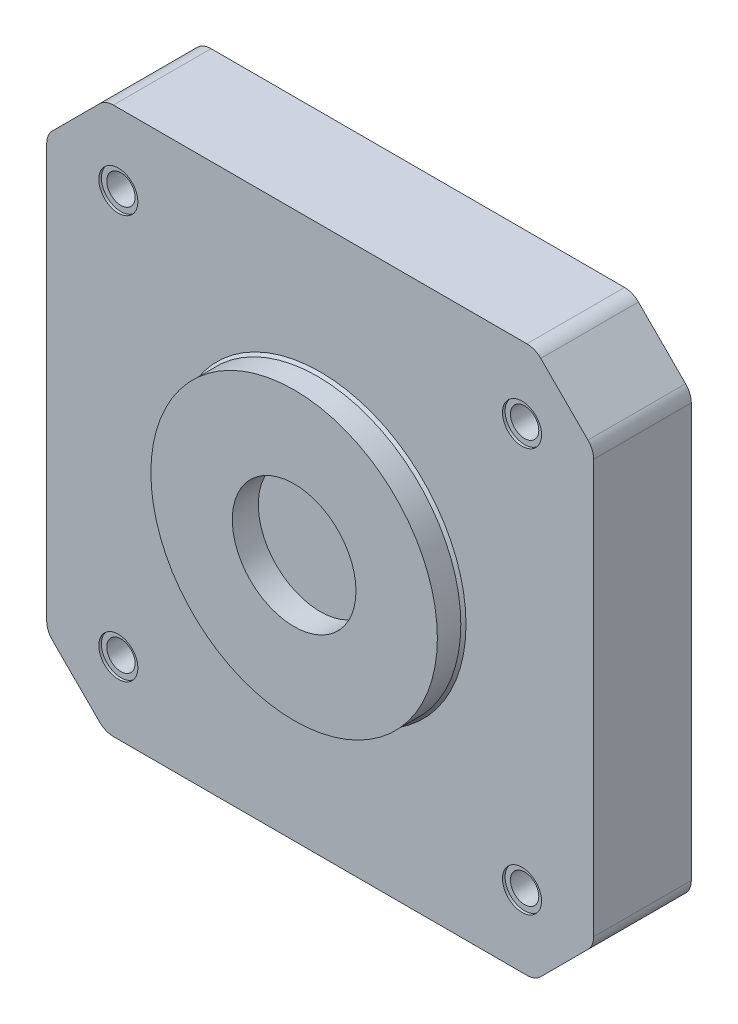
ISO-10303-21;
HEADER;
FILE_DESCRIPTION(('STEP AP214'),'2;1');
FILE_NAME('part.step','',(''),(''),'','','');
FILE_SCHEMA(('AUTOMOTIVE_DESIGN { 1 0 10303 214 1 1 1 1 }'));
ENDSEC;
DATA;
#1=APPLICATION_CONTEXT('core data for automotive mechanical design processes');
#2=APPLICATION_PROTOCOL_DEFINITION('international standard','automotive_design',2000,#1);
#3=PRODUCT_CONTEXT('',#1,'mechanical');
#4=PRODUCT('Part','Part','',(#3));
#5=PRODUCT_RELATED_PRODUCT_CATEGORY('part','',(#4));
#6=PRODUCT_DEFINITION_FORMATION('','',#4);
#7=PRODUCT_DEFINITION_CONTEXT('part definition',#1,'design');
#8=PRODUCT_DEFINITION('design','',#6,#7);
#9=PRODUCT_DEFINITION_SHAPE('','',#8);
#10=(LENGTH_UNIT() NAMED_UNIT(*) SI_UNIT(.MILLI.,.METRE.));
#11=(NAMED_UNIT(*) PLANE_ANGLE_UNIT() SI_UNIT($,.RADIAN.));
#12=(NAMED_UNIT(*) SI_UNIT($,.STERADIAN.) SOLID_ANGLE_UNIT());
#13=UNCERTAINTY_MEASURE_WITH_UNIT(LENGTH_MEASURE(1.E-05),#10,'distance_accuracy_value','');
#14=(GEOMETRIC_REPRESENTATION_CONTEXT(3) GLOBAL_UNCERTAINTY_ASSIGNED_CONTEXT((#13)) GLOBAL_UNIT_ASSIGNED_CONTEXT((#10,
#11,#12)) REPRESENTATION_CONTEXT('',''));
#15=CARTESIAN_POINT('',(0.,0.,0.));
#16=DIRECTION('',(0.,0.,1.));
#17=DIRECTION('',(1.,0.,0.));
#18=AXIS2_PLACEMENT_3D('',#15,#16,#17);
#19=CARTESIAN_POINT('',(0.,0.,37.5));
#20=DIRECTION('',(0.,0.,1.));
#21=DIRECTION('',(1.,0.,0.));
#22=AXIS2_PLACEMENT_3D('',#19,#20,#21);
#23=PLANE('',#22);
#24=CARTESIAN_POINT('',(0.,0.,37.5));
#25=DIRECTION('',(0.,0.,1.));
#26=DIRECTION('',(-1.,0.,0.));
#27=AXIS2_PLACEMENT_3D('',#24,#25,#26);
#28=CIRCLE('',#27,4.75);
#29=CARTESIAN_POINT('',(4.75,0.,37.5));
#30=VERTEX_POINT('',#29);
#31=EDGE_CURVE('E331',#30,#30,#28,.T.);
#32=ORIENTED_EDGE('',*,*,#31,.T.);
#33=EDGE_LOOP('',(#32));
#34=FACE_BOUND('',#33,.T.);
#35=ADVANCED_FACE('F17',(#34),#23,.T.);
#36=CARTESIAN_POINT('',(21.,-16.5,30.));
#37=DIRECTION('',(1.,0.,0.));
#38=DIRECTION('',(0.,1.,0.));
#39=AXIS2_PLACEMENT_3D('',#36,#37,#38);
#40=PLANE('',#39);
#41=DIRECTION('',(0.,0.,-1.));
#42=VECTOR('',#41,1.);
#43=CARTESIAN_POINT('',(21.,15.8786796564404,30.));
#44=LINE('',#43,#42);
#45=CARTESIAN_POINT('',(21.,15.8786796564404,37.5));
#46=VERTEX_POINT('',#45);
#47=CARTESIAN_POINT('',(21.,15.8786796564404,30.));
#48=VERTEX_POINT('',#47);
#49=EDGE_CURVE('E156',#46,#48,#44,.T.);
#50=ORIENTED_EDGE('',*,*,#49,.F.);
#51=DIRECTION('',(0.,1.,0.));
#52=VECTOR('',#51,1.);
#53=CARTESIAN_POINT('',(21.,16.5,37.5));
#54=LINE('',#53,#52);
#55=CARTESIAN_POINT('',(21.,-15.8786796564404,37.5));
#56=VERTEX_POINT('',#55);
#57=EDGE_CURVE('E276',#56,#46,#54,.T.);
#58=ORIENTED_EDGE('',*,*,#57,.F.);
#59=DIRECTION('',(0.,0.,1.));
#60=VECTOR('',#59,1.);
#61=CARTESIAN_POINT('',(21.,-15.8786796564404,30.));
#62=LINE('',#61,#60);
#63=CARTESIAN_POINT('',(21.,-15.8786796564404,30.));
#64=VERTEX_POINT('',#63);
#65=EDGE_CURVE('E269',#64,#56,#62,.T.);
#66=ORIENTED_EDGE('',*,*,#65,.F.);
#67=DIRECTION('',(0.,-1.,0.));
#68=VECTOR('',#67,1.);
#69=CARTESIAN_POINT('',(21.,16.5,30.));
#70=LINE('',#69,#68);
#71=EDGE_CURVE('E273',#48,#64,#70,.T.);
#72=ORIENTED_EDGE('',*,*,#71,.F.);
#73=EDGE_LOOP('',(#50,#58,#66,#72));
#74=FACE_BOUND('',#73,.T.);
#75=ADVANCED_FACE('F271',(#74),#40,.T.);
#76=CARTESIAN_POINT('',(16.5,21.,30.));
#77=DIRECTION('',(0.,1.,0.));
#78=DIRECTION('',(1.,0.,0.));
#79=AXIS2_PLACEMENT_3D('',#76,#77,#78);
#80=PLANE('',#79);
#81=DIRECTION('',(0.,0.,1.));
#82=VECTOR('',#81,1.);
#83=CARTESIAN_POINT('',(15.8786796564404,21.,30.));
#84=LINE('',#83,#82);
#85=CARTESIAN_POINT('',(15.8786796564404,21.,30.));
#86=VERTEX_POINT('',#85);
#87=CARTESIAN_POINT('',(15.8786796564404,21.,37.5));
#88=VERTEX_POINT('',#87);
#89=EDGE_CURVE('E374',#86,#88,#84,.T.);
#90=ORIENTED_EDGE('',*,*,#89,.F.);
#91=DIRECTION('',(1.,0.,0.));
#92=VECTOR('',#91,1.);
#93=CARTESIAN_POINT('',(-16.5,21.,30.));
#94=LINE('',#93,#92);
#95=CARTESIAN_POINT('',(-15.8786796564404,21.,30.));
#96=VERTEX_POINT('',#95);
#97=EDGE_CURVE('E375',#96,#86,#94,.T.);
#98=ORIENTED_EDGE('',*,*,#97,.F.);
#99=DIRECTION('',(0.,0.,-1.));
#100=VECTOR('',#99,1.);
#101=CARTESIAN_POINT('',(-15.8786796564404,21.,30.));
#102=LINE('',#101,#100);
#103=CARTESIAN_POINT('',(-15.8786796564404,21.,37.5));
#104=VERTEX_POINT('',#103);
#105=EDGE_CURVE('E42',#104,#96,#102,.T.);
#106=ORIENTED_EDGE('',*,*,#105,.F.);
#107=DIRECTION('',(-1.,0.,0.));
#108=VECTOR('',#107,1.);
#109=CARTESIAN_POINT('',(-16.5,21.,37.5));
#110=LINE('',#109,#108);
#111=EDGE_CURVE('E480',#88,#104,#110,.T.);
#112=ORIENTED_EDGE('',*,*,#111,.F.);
#113=EDGE_LOOP('',(#90,#98,#106,#112));
#114=FACE_BOUND('',#113,.T.);
#115=ADVANCED_FACE('F785',(#114),#80,.T.);
#116=CARTESIAN_POINT('',(-21.,-16.5,30.));
#117=DIRECTION('',(-0.707106781186548,-0.707106781186548,0.));
#118=DIRECTION('',(-0.707106781186548,0.707106781186548,0.));
#119=AXIS2_PLACEMENT_3D('',#116,#117,#118);
#120=PLANE('',#119);
#121=DIRECTION('',(0.,0.,-1.));
#122=VECTOR('',#121,1.);
#123=CARTESIAN_POINT('',(-16.9393398282202,-20.5606601717798,30.));
#124=LINE('',#123,#122);
#125=CARTESIAN_POINT('',(-16.9393398282202,-20.5606601717798,37.5));
#126=VERTEX_POINT('',#125);
#127=CARTESIAN_POINT('',(-16.9393398282202,-20.5606601717798,30.));
#128=VERTEX_POINT('',#127);
#129=EDGE_CURVE('E345',#126,#128,#124,.T.);
#130=ORIENTED_EDGE('',*,*,#129,.F.);
#131=DIRECTION('',(0.707106781186548,-0.707106781186548,0.));
#132=VECTOR('',#131,1.);
#133=CARTESIAN_POINT('',(-16.5,-21.,37.5));
#134=LINE('',#133,#132);
#135=CARTESIAN_POINT('',(-20.5606601717798,-16.9393398282202,37.5));
#136=VERTEX_POINT('',#135);
#137=EDGE_CURVE('E326',#136,#126,#134,.T.);
#138=ORIENTED_EDGE('',*,*,#137,.F.);
#139=DIRECTION('',(0.,0.,1.));
#140=VECTOR('',#139,1.);
#141=CARTESIAN_POINT('',(-20.5606601717798,-16.9393398282202,30.));
#142=LINE('',#141,#140);
#143=CARTESIAN_POINT('',(-20.5606601717798,-16.9393398282202,30.));
#144=VERTEX_POINT('',#143);
#145=EDGE_CURVE('E11',#144,#136,#142,.T.);
#146=ORIENTED_EDGE('',*,*,#145,.F.);
#147=DIRECTION('',(-0.707106781186548,0.707106781186548,0.));
#148=VECTOR('',#147,1.);
#149=CARTESIAN_POINT('',(-16.5,-21.,30.));
#150=LINE('',#149,#148);
#151=EDGE_CURVE('E455',#128,#144,#150,.T.);
#152=ORIENTED_EDGE('',*,*,#151,.F.);
#153=EDGE_LOOP('',(#130,#138,#146,#152));
#154=FACE_BOUND('',#153,.T.);
#155=ADVANCED_FACE('F779',(#154),#120,.T.);
#156=CARTESIAN_POINT('',(-19.5,-15.8786796564404,30.));
#157=DIRECTION('',(0.,0.,1.));
#158=DIRECTION('',(-0.923879532511287,-0.38268343236509,0.));
#159=AXIS2_PLACEMENT_3D('',#156,#157,#158);
#160=CYLINDRICAL_SURFACE('',#159,1.5);
#161=CARTESIAN_POINT('',(-19.5,-15.8786796564404,37.5));
#162=DIRECTION('',(0.,0.,-1.));
#163=DIRECTION('',(-0.923879532511287,-0.38268343236509,0.));
#164=AXIS2_PLACEMENT_3D('',#161,#162,#163);
#165=CIRCLE('',#164,1.5);
#166=CARTESIAN_POINT('',(-21.,-15.8786796564404,37.5));
#167=VERTEX_POINT('',#166);
#168=EDGE_CURVE('E21',#136,#167,#165,.T.);
#169=ORIENTED_EDGE('',*,*,#168,.T.);
#170=DIRECTION('',(0.,0.,-1.));
#171=VECTOR('',#170,1.);
#172=CARTESIAN_POINT('',(-21.,-15.8786796564404,30.));
#173=LINE('',#172,#171);
#174=CARTESIAN_POINT('',(-21.,-15.8786796564404,30.));
#175=VERTEX_POINT('',#174);
#176=EDGE_CURVE('E198',#167,#175,#173,.T.);
#177=ORIENTED_EDGE('',*,*,#176,.T.);
#178=CARTESIAN_POINT('',(-19.5,-15.8786796564404,30.));
#179=DIRECTION('',(0.,0.,1.));
#180=DIRECTION('',(-0.923879532511287,-0.38268343236509,0.));
#181=AXIS2_PLACEMENT_3D('',#178,#179,#180);
#182=CIRCLE('',#181,1.5);
#183=EDGE_CURVE('E459',#175,#144,#182,.T.);
#184=ORIENTED_EDGE('',*,*,#183,.T.);
#185=ORIENTED_EDGE('',*,*,#145,.T.);
#186=EDGE_LOOP('',(#169,#177,#184,#185));
#187=FACE_BOUND('',#186,.T.);
#188=ADVANCED_FACE('F773',(#187),#160,.T.);
#189=CARTESIAN_POINT('',(-16.5,-21.,30.));
#190=DIRECTION('',(0.,-1.,0.));
#191=DIRECTION('',(0.,0.,-1.));
#192=AXIS2_PLACEMENT_3D('',#189,#190,#191);
#193=PLANE('',#192);
#194=DIRECTION('',(0.,0.,-1.));
#195=VECTOR('',#194,1.);
#196=CARTESIAN_POINT('',(15.8786796564404,-21.,30.));
#197=LINE('',#196,#195);
#198=CARTESIAN_POINT('',(15.8786796564404,-21.,37.5));
#199=VERTEX_POINT('',#198);
#200=CARTESIAN_POINT('',(15.8786796564404,-21.,30.));
#201=VERTEX_POINT('',#200);
#202=EDGE_CURVE('E391',#199,#201,#197,.T.);
#203=ORIENTED_EDGE('',*,*,#202,.F.);
#204=DIRECTION('',(1.,0.,0.));
#205=VECTOR('',#204,1.);
#206=CARTESIAN_POINT('',(16.5,-21.,37.5));
#207=LINE('',#206,#205);
#208=CARTESIAN_POINT('',(-15.8786796564404,-21.,37.5));
#209=VERTEX_POINT('',#208);
#210=EDGE_CURVE('E396',#209,#199,#207,.T.);
#211=ORIENTED_EDGE('',*,*,#210,.F.);
#212=DIRECTION('',(0.,0.,1.));
#213=VECTOR('',#212,1.);
#214=CARTESIAN_POINT('',(-15.8786796564404,-21.,30.));
#215=LINE('',#214,#213);
#216=CARTESIAN_POINT('',(-15.8786796564404,-21.,30.));
#217=VERTEX_POINT('',#216);
#218=EDGE_CURVE('E28',#217,#209,#215,.T.);
#219=ORIENTED_EDGE('',*,*,#218,.F.);
#220=DIRECTION('',(-1.,0.,0.));
#221=VECTOR('',#220,1.);
#222=CARTESIAN_POINT('',(16.5,-21.,30.));
#223=LINE('',#222,#221);
#224=EDGE_CURVE('E520',#201,#217,#223,.T.);
#225=ORIENTED_EDGE('',*,*,#224,.F.);
#226=EDGE_LOOP('',(#203,#211,#219,#225));
#227=FACE_BOUND('',#226,.T.);
#228=ADVANCED_FACE('F778',(#227),#193,.T.);
#229=CARTESIAN_POINT('',(-15.8786796564404,-19.5,30.));
#230=DIRECTION('',(0.,0.,1.));
#231=DIRECTION('',(-0.382683432365092,-0.923879532511286,0.));
#232=AXIS2_PLACEMENT_3D('',#229,#230,#231);
#233=CYLINDRICAL_SURFACE('',#232,1.5);
#234=CARTESIAN_POINT('',(-15.8786796564404,-19.5,37.5));
#235=DIRECTION('',(0.,0.,-1.));
#236=DIRECTION('',(-0.382683432365092,-0.923879532511286,0.));
#237=AXIS2_PLACEMENT_3D('',#234,#235,#236);
#238=CIRCLE('',#237,1.5);
#239=EDGE_CURVE('E330',#209,#126,#238,.T.);
#240=ORIENTED_EDGE('',*,*,#239,.T.);
#241=ORIENTED_EDGE('',*,*,#129,.T.);
#242=CARTESIAN_POINT('',(-15.8786796564404,-19.5,30.));
#243=DIRECTION('',(0.,0.,1.));
#244=DIRECTION('',(-0.382683432365092,-0.923879532511286,0.));
#245=AXIS2_PLACEMENT_3D('',#242,#243,#244);
#246=CIRCLE('',#245,1.5);
#247=EDGE_CURVE('E460',#128,#217,#246,.T.);
#248=ORIENTED_EDGE('',*,*,#247,.T.);
#249=ORIENTED_EDGE('',*,*,#218,.T.);
#250=EDGE_LOOP('',(#240,#241,#248,#249));
#251=FACE_BOUND('',#250,.T.);
#252=ADVANCED_FACE('F731',(#251),#233,.T.);
#253=CARTESIAN_POINT('',(-21.,16.5,30.));
#254=DIRECTION('',(-1.,0.,0.));
#255=DIRECTION('',(0.,0.,1.));
#256=AXIS2_PLACEMENT_3D('',#253,#254,#255);
#257=PLANE('',#256);
#258=DIRECTION('',(0.,0.,1.));
#259=VECTOR('',#258,1.);
#260=CARTESIAN_POINT('',(-21.,15.8786796564404,30.));
#261=LINE('',#260,#259);
#262=CARTESIAN_POINT('',(-21.,15.8786796564403,30.));
#263=VERTEX_POINT('',#262);
#264=CARTESIAN_POINT('',(-21.,15.8786796564403,37.5));
#265=VERTEX_POINT('',#264);
#266=EDGE_CURVE('E339',#263,#265,#261,.T.);
#267=ORIENTED_EDGE('',*,*,#266,.F.);
#268=DIRECTION('',(0.,1.,0.));
#269=VECTOR('',#268,1.);
#270=CARTESIAN_POINT('',(-21.,-16.5,30.));
#271=LINE('',#270,#269);
#272=EDGE_CURVE('E533',#175,#263,#271,.T.);
#273=ORIENTED_EDGE('',*,*,#272,.F.);
#274=ORIENTED_EDGE('',*,*,#176,.F.);
#275=DIRECTION('',(0.,-1.,0.));
#276=VECTOR('',#275,1.);
#277=CARTESIAN_POINT('',(-21.,-16.5,37.5));
#278=LINE('',#277,#276);
#279=EDGE_CURVE('E352',#265,#167,#278,.T.);
#280=ORIENTED_EDGE('',*,*,#279,.F.);
#281=EDGE_LOOP('',(#267,#273,#274,#280));
#282=FACE_BOUND('',#281,.T.);
#283=ADVANCED_FACE('F502',(#282),#257,.T.);
#284=CARTESIAN_POINT('',(-19.5,15.8786796564404,30.));
#285=DIRECTION('',(0.,0.,1.));
#286=DIRECTION('',(-0.923879532511287,0.38268343236509,0.));
#287=AXIS2_PLACEMENT_3D('',#284,#285,#286);
#288=CYLINDRICAL_SURFACE('',#287,1.5);
#289=CARTESIAN_POINT('',(-19.5,15.8786796564404,37.5));
#290=DIRECTION('',(0.,0.,-1.));
#291=DIRECTION('',(-0.923879532511287,0.38268343236509,0.));
#292=AXIS2_PLACEMENT_3D('',#289,#290,#291);
#293=CIRCLE('',#292,1.5);
#294=CARTESIAN_POINT('',(-20.5606601717798,16.9393398282202,37.5));
#295=VERTEX_POINT('',#294);
#296=EDGE_CURVE('E356',#265,#295,#293,.T.);
#297=ORIENTED_EDGE('',*,*,#296,.T.);
#298=DIRECTION('',(0.,0.,-1.));
#299=VECTOR('',#298,1.);
#300=CARTESIAN_POINT('',(-20.5606601717798,16.9393398282202,30.));
#301=LINE('',#300,#299);
#302=CARTESIAN_POINT('',(-20.5606601717798,16.9393398282202,30.));
#303=VERTEX_POINT('',#302);
#304=EDGE_CURVE('E313',#295,#303,#301,.T.);
#305=ORIENTED_EDGE('',*,*,#304,.T.);
#306=CARTESIAN_POINT('',(-19.5,15.8786796564404,30.));
#307=DIRECTION('',(0.,0.,1.));
#308=DIRECTION('',(-0.923879532511287,0.38268343236509,0.));
#309=AXIS2_PLACEMENT_3D('',#306,#307,#308);
#310=CIRCLE('',#309,1.5);
#311=EDGE_CURVE('E382',#303,#263,#310,.T.);
#312=ORIENTED_EDGE('',*,*,#311,.T.);
#313=ORIENTED_EDGE('',*,*,#266,.T.);
#314=EDGE_LOOP('',(#297,#305,#312,#313));
#315=FACE_BOUND('',#314,.T.);
#316=ADVANCED_FACE('F498',(#315),#288,.T.);
#317=CARTESIAN_POINT('',(-16.5,21.,30.));
#318=DIRECTION('',(-0.707106781186547,0.707106781186548,0.));
#319=DIRECTION('',(0.,0.,1.));
#320=AXIS2_PLACEMENT_3D('',#317,#318,#319);
#321=PLANE('',#320);
#322=DIRECTION('',(0.,0.,1.));
#323=VECTOR('',#322,1.);
#324=CARTESIAN_POINT('',(-16.9393398282202,20.5606601717798,30.));
#325=LINE('',#324,#323);
#326=CARTESIAN_POINT('',(-16.9393398282202,20.5606601717798,30.));
#327=VERTEX_POINT('',#326);
#328=CARTESIAN_POINT('',(-16.9393398282202,20.5606601717798,37.5));
#329=VERTEX_POINT('',#328);
#330=EDGE_CURVE('E310',#327,#329,#325,.T.);
#331=ORIENTED_EDGE('',*,*,#330,.F.);
#332=DIRECTION('',(-0.707106781186548,-0.707106781186547,0.));
#333=VECTOR('',#332,1.);
#334=CARTESIAN_POINT('',(-16.5,21.,30.));
#335=LINE('',#334,#333);
#336=EDGE_CURVE('E378',#327,#303,#335,.T.);
#337=ORIENTED_EDGE('',*,*,#336,.T.);
#338=ORIENTED_EDGE('',*,*,#304,.F.);
#339=DIRECTION('',(-0.707106781186548,-0.707106781186547,0.));
#340=VECTOR('',#339,1.);
#341=CARTESIAN_POINT('',(-16.5,21.,37.5));
#342=LINE('',#341,#340);
#343=EDGE_CURVE('E401',#329,#295,#342,.T.);
#344=ORIENTED_EDGE('',*,*,#343,.F.);
#345=EDGE_LOOP('',(#331,#337,#338,#344));
#346=FACE_BOUND('',#345,.T.);
#347=ADVANCED_FACE('F830',(#346),#321,.T.);
#348=CARTESIAN_POINT('',(-15.8786796564404,19.5,30.));
#349=DIRECTION('',(0.,0.,1.));
#350=DIRECTION('',(-0.382683432365089,0.923879532511287,0.));
#351=AXIS2_PLACEMENT_3D('',#348,#349,#350);
#352=CYLINDRICAL_SURFACE('',#351,1.5);
#353=CARTESIAN_POINT('',(-15.8786796564404,19.5,37.5));
#354=DIRECTION('',(0.,0.,-1.));
#355=DIRECTION('',(-0.382683432365089,0.923879532511287,0.));
#356=AXIS2_PLACEMENT_3D('',#353,#354,#355);
#357=CIRCLE('',#356,1.5);
#358=EDGE_CURVE('E405',#329,#104,#357,.T.);
#359=ORIENTED_EDGE('',*,*,#358,.T.);
#360=ORIENTED_EDGE('',*,*,#105,.T.);
#361=CARTESIAN_POINT('',(-15.8786796564404,19.5,30.));
#362=DIRECTION('',(0.,0.,1.));
#363=DIRECTION('',(-0.382683432365089,0.923879532511287,0.));
#364=AXIS2_PLACEMENT_3D('',#361,#362,#363);
#365=CIRCLE('',#364,1.5);
#366=EDGE_CURVE('E303',#96,#327,#365,.T.);
#367=ORIENTED_EDGE('',*,*,#366,.T.);
#368=ORIENTED_EDGE('',*,*,#330,.T.);
#369=EDGE_LOOP('',(#359,#360,#367,#368));
#370=FACE_BOUND('',#369,.T.);
#371=ADVANCED_FACE('F835',(#370),#352,.T.);
#372=CARTESIAN_POINT('',(15.8786796564404,-19.5,30.));
#373=DIRECTION('',(0.,0.,1.));
#374=DIRECTION('',(0.382683432365092,-0.923879532511286,0.));
#375=AXIS2_PLACEMENT_3D('',#372,#373,#374);
#376=CYLINDRICAL_SURFACE('',#375,1.5);
#377=CARTESIAN_POINT('',(15.8786796564404,-19.5,37.5));
#378=DIRECTION('',(0.,0.,-1.));
#379=DIRECTION('',(0.382683432365092,-0.923879532511286,0.));
#380=AXIS2_PLACEMENT_3D('',#377,#378,#379);
#381=CIRCLE('',#380,1.5);
#382=CARTESIAN_POINT('',(16.9393398282202,-20.5606601717798,37.5));
#383=VERTEX_POINT('',#382);
#384=EDGE_CURVE('E400',#383,#199,#381,.T.);
#385=ORIENTED_EDGE('',*,*,#384,.T.);
#386=ORIENTED_EDGE('',*,*,#202,.T.);
#387=CARTESIAN_POINT('',(15.8786796564404,-19.5,30.));
#388=DIRECTION('',(0.,0.,1.));
#389=DIRECTION('',(0.382683432365092,-0.923879532511286,0.));
#390=AXIS2_PLACEMENT_3D('',#387,#388,#389);
#391=CIRCLE('',#390,1.5);
#392=CARTESIAN_POINT('',(16.9393398282202,-20.5606601717798,30.));
#393=VERTEX_POINT('',#392);
#394=EDGE_CURVE('E342',#201,#393,#391,.T.);
#395=ORIENTED_EDGE('',*,*,#394,.T.);
#396=DIRECTION('',(0.,0.,1.));
#397=VECTOR('',#396,1.);
#398=CARTESIAN_POINT('',(16.9393398282202,-20.5606601717798,30.));
#399=LINE('',#398,#397);
#400=EDGE_CURVE('E106',#393,#383,#399,.T.);
#401=ORIENTED_EDGE('',*,*,#400,.T.);
#402=EDGE_LOOP('',(#385,#386,#395,#401));
#403=FACE_BOUND('',#402,.T.);
#404=ADVANCED_FACE('F546',(#403),#376,.T.);
#405=CARTESIAN_POINT('',(16.5,-21.,30.));
#406=DIRECTION('',(0.707106781186548,-0.707106781186548,0.));
#407=DIRECTION('',(0.,0.,-1.));
#408=AXIS2_PLACEMENT_3D('',#405,#406,#407);
#409=PLANE('',#408);
#410=DIRECTION('',(0.,0.,-1.));
#411=VECTOR('',#410,1.);
#412=CARTESIAN_POINT('',(20.5606601717798,-16.9393398282202,30.));
#413=LINE('',#412,#411);
#414=CARTESIAN_POINT('',(20.5606601717798,-16.9393398282202,37.5));
#415=VERTEX_POINT('',#414);
#416=CARTESIAN_POINT('',(20.5606601717798,-16.9393398282202,30.));
#417=VERTEX_POINT('',#416);
#418=EDGE_CURVE('E118',#415,#417,#413,.T.);
#419=ORIENTED_EDGE('',*,*,#418,.F.);
#420=DIRECTION('',(0.707106781186548,0.707106781186548,0.));
#421=VECTOR('',#420,1.);
#422=CARTESIAN_POINT('',(16.5,-21.,37.5));
#423=LINE('',#422,#421);
#424=EDGE_CURVE('E386',#383,#415,#423,.T.);
#425=ORIENTED_EDGE('',*,*,#424,.F.);
#426=ORIENTED_EDGE('',*,*,#400,.F.);
#427=DIRECTION('',(0.707106781186548,0.707106781186548,0.));
#428=VECTOR('',#427,1.);
#429=CARTESIAN_POINT('',(16.5,-21.,30.));
#430=LINE('',#429,#428);
#431=EDGE_CURVE('E287',#393,#417,#430,.T.);
#432=ORIENTED_EDGE('',*,*,#431,.T.);
#433=EDGE_LOOP('',(#419,#425,#426,#432));
#434=FACE_BOUND('',#433,.T.);
#435=ADVANCED_FACE('F544',(#434),#409,.T.);
#436=CARTESIAN_POINT('',(19.5,-15.8786796564404,30.));
#437=DIRECTION('',(0.,0.,1.));
#438=DIRECTION('',(0.923879532511287,-0.38268343236509,0.));
#439=AXIS2_PLACEMENT_3D('',#436,#437,#438);
#440=CYLINDRICAL_SURFACE('',#439,1.5);
#441=CARTESIAN_POINT('',(19.5,-15.8786796564404,37.5));
#442=DIRECTION('',(0.,0.,-1.));
#443=DIRECTION('',(0.923879532511287,-0.38268343236509,0.));
#444=AXIS2_PLACEMENT_3D('',#441,#442,#443);
#445=CIRCLE('',#444,1.5);
#446=EDGE_CURVE('E383',#56,#415,#445,.T.);
#447=ORIENTED_EDGE('',*,*,#446,.T.);
#448=ORIENTED_EDGE('',*,*,#418,.T.);
#449=CARTESIAN_POINT('',(19.5,-15.8786796564404,30.));
#450=DIRECTION('',(0.,0.,1.));
#451=DIRECTION('',(0.923879532511287,-0.38268343236509,0.));
#452=AXIS2_PLACEMENT_3D('',#449,#450,#451);
#453=CIRCLE('',#452,1.5);
#454=EDGE_CURVE('E282',#417,#64,#453,.T.);
#455=ORIENTED_EDGE('',*,*,#454,.T.);
#456=ORIENTED_EDGE('',*,*,#65,.T.);
#457=EDGE_LOOP('',(#447,#448,#455,#456));
#458=FACE_BOUND('',#457,.T.);
#459=ADVANCED_FACE('F283',(#458),#440,.T.);
#460=CARTESIAN_POINT('',(19.5,15.8786796564404,30.));
#461=DIRECTION('',(0.,0.,1.));
#462=DIRECTION('',(0.923879532511287,0.38268343236509,0.));
#463=AXIS2_PLACEMENT_3D('',#460,#461,#462);
#464=CYLINDRICAL_SURFACE('',#463,1.5);
#465=CARTESIAN_POINT('',(19.5,15.8786796564404,37.5));
#466=DIRECTION('',(0.,0.,-1.));
#467=DIRECTION('',(0.923879532511287,0.38268343236509,0.));
#468=AXIS2_PLACEMENT_3D('',#465,#466,#467);
#469=CIRCLE('',#468,1.5);
#470=CARTESIAN_POINT('',(20.5606601717798,16.9393398282202,37.5));
#471=VERTEX_POINT('',#470);
#472=EDGE_CURVE('E425',#471,#46,#469,.T.);
#473=ORIENTED_EDGE('',*,*,#472,.T.);
#474=ORIENTED_EDGE('',*,*,#49,.T.);
#475=CARTESIAN_POINT('',(19.5,15.8786796564404,30.));
#476=DIRECTION('',(0.,0.,1.));
#477=DIRECTION('',(0.923879532511287,0.38268343236509,0.));
#478=AXIS2_PLACEMENT_3D('',#475,#476,#477);
#479=CIRCLE('',#478,1.5);
#480=CARTESIAN_POINT('',(20.5606601717798,16.9393398282202,30.));
#481=VERTEX_POINT('',#480);
#482=EDGE_CURVE('E292',#48,#481,#479,.T.);
#483=ORIENTED_EDGE('',*,*,#482,.T.);
#484=DIRECTION('',(0.,0.,1.));
#485=VECTOR('',#484,1.);
#486=CARTESIAN_POINT('',(20.5606601717798,16.9393398282202,30.));
#487=LINE('',#486,#485);
#488=EDGE_CURVE('E166',#481,#471,#487,.T.);
#489=ORIENTED_EDGE('',*,*,#488,.T.);
#490=EDGE_LOOP('',(#473,#474,#483,#489));
#491=FACE_BOUND('',#490,.T.);
#492=ADVANCED_FACE('F887',(#491),#464,.T.);
#493=CARTESIAN_POINT('',(21.,16.5,30.));
#494=DIRECTION('',(0.707106781186548,0.707106781186548,0.));
#495=DIRECTION('',(0.,0.,-1.));
#496=AXIS2_PLACEMENT_3D('',#493,#494,#495);
#497=PLANE('',#496);
#498=DIRECTION('',(0.,0.,-1.));
#499=VECTOR('',#498,1.);
#500=CARTESIAN_POINT('',(16.9393398282202,20.5606601717798,30.));
#501=LINE('',#500,#499);
#502=CARTESIAN_POINT('',(16.9393398282202,20.5606601717798,37.5));
#503=VERTEX_POINT('',#502);
#504=CARTESIAN_POINT('',(16.9393398282202,20.5606601717798,30.));
#505=VERTEX_POINT('',#504);
#506=EDGE_CURVE('E335',#503,#505,#501,.T.);
#507=ORIENTED_EDGE('',*,*,#506,.F.);
#508=DIRECTION('',(-0.707106781186548,0.707106781186548,0.));
#509=VECTOR('',#508,1.);
#510=CARTESIAN_POINT('',(16.5,21.,37.5));
#511=LINE('',#510,#509);
#512=EDGE_CURVE('E436',#471,#503,#511,.T.);
#513=ORIENTED_EDGE('',*,*,#512,.F.);
#514=ORIENTED_EDGE('',*,*,#488,.F.);
#515=DIRECTION('',(0.707106781186548,-0.707106781186548,0.));
#516=VECTOR('',#515,1.);
#517=CARTESIAN_POINT('',(16.5,21.,30.));
#518=LINE('',#517,#516);
#519=EDGE_CURVE('E299',#505,#481,#518,.T.);
#520=ORIENTED_EDGE('',*,*,#519,.F.);
#521=EDGE_LOOP('',(#507,#513,#514,#520));
#522=FACE_BOUND('',#521,.T.);
#523=ADVANCED_FACE('F19',(#522),#497,.T.);
#524=CARTESIAN_POINT('',(0.,0.,30.));
#525=DIRECTION('',(0.,0.,1.));
#526=DIRECTION('',(1.,0.,0.));
#527=AXIS2_PLACEMENT_3D('',#524,#525,#526);
#528=PLANE('',#527);
#529=CARTESIAN_POINT('',(15.8786796564404,19.5,30.));
#530=DIRECTION('',(0.,0.,1.));
#531=DIRECTION('',(0.382683432365092,0.923879532511286,0.));
#532=AXIS2_PLACEMENT_3D('',#529,#530,#531);
#533=CIRCLE('',#532,1.5);
#534=EDGE_CURVE('E370',#505,#86,#533,.T.);
#535=ORIENTED_EDGE('',*,*,#534,.F.);
#536=ORIENTED_EDGE('',*,*,#519,.T.);
#537=ORIENTED_EDGE('',*,*,#482,.F.);
#538=ORIENTED_EDGE('',*,*,#71,.T.);
#539=ORIENTED_EDGE('',*,*,#454,.F.);
#540=ORIENTED_EDGE('',*,*,#431,.F.);
#541=ORIENTED_EDGE('',*,*,#394,.F.);
#542=ORIENTED_EDGE('',*,*,#224,.T.);
#543=ORIENTED_EDGE('',*,*,#247,.F.);
#544=ORIENTED_EDGE('',*,*,#151,.T.);
#545=ORIENTED_EDGE('',*,*,#183,.F.);
#546=ORIENTED_EDGE('',*,*,#272,.T.);
#547=ORIENTED_EDGE('',*,*,#311,.F.);
#548=ORIENTED_EDGE('',*,*,#336,.F.);
#549=ORIENTED_EDGE('',*,*,#366,.F.);
#550=ORIENTED_EDGE('',*,*,#97,.T.);
#551=EDGE_LOOP('',(#535,#536,#537,#538,#539,#540,#541,#542,#543,#544,#545,#546,#547,#548,#549,#550));
#552=FACE_BOUND('',#551,.T.);
#553=ADVANCED_FACE('F290',(#552),#528,.F.);
#554=CARTESIAN_POINT('',(15.8786796564404,19.5,30.));
#555=DIRECTION('',(0.,0.,1.));
#556=DIRECTION('',(0.382683432365092,0.923879532511286,0.));
#557=AXIS2_PLACEMENT_3D('',#554,#555,#556);
#558=CYLINDRICAL_SURFACE('',#557,1.5);
#559=CARTESIAN_POINT('',(15.8786796564404,19.5,37.5));
#560=DIRECTION('',(0.,0.,-1.));
#561=DIRECTION('',(0.382683432365092,0.923879532511286,0.));
#562=AXIS2_PLACEMENT_3D('',#559,#560,#561);
#563=CIRCLE('',#562,1.5);
#564=EDGE_CURVE('E471',#88,#503,#563,.T.);
#565=ORIENTED_EDGE('',*,*,#564,.T.);
#566=ORIENTED_EDGE('',*,*,#506,.T.);
#567=ORIENTED_EDGE('',*,*,#534,.T.);
#568=ORIENTED_EDGE('',*,*,#89,.T.);
#569=EDGE_LOOP('',(#565,#566,#567,#568));
#570=FACE_BOUND('',#569,.T.);
#571=ADVANCED_FACE('F938',(#570),#558,.T.);
#572=CARTESIAN_POINT('',(0.,0.,39.5));
#573=DIRECTION('',(0.,0.,1.));
#574=DIRECTION('',(1.,0.,0.));
#575=AXIS2_PLACEMENT_3D('',#572,#573,#574);
#576=PLANE('',#575);
#577=CARTESIAN_POINT('',(0.,0.,39.5));
#578=DIRECTION('',(0.,0.,-1.));
#579=DIRECTION('',(-1.,0.,0.));
#580=AXIS2_PLACEMENT_3D('',#577,#578,#579);
#581=CIRCLE('',#580,4.75);
#582=CARTESIAN_POINT('',(4.75,0.,39.5));
#583=VERTEX_POINT('',#582);
#584=EDGE_CURVE('E366',#583,#583,#581,.T.);
#585=ORIENTED_EDGE('',*,*,#584,.T.);
#586=EDGE_LOOP('',(#585));
#587=FACE_BOUND('',#586,.T.);
#588=CARTESIAN_POINT('',(0.,0.,39.5));
#589=DIRECTION('',(0.,0.,1.));
#590=DIRECTION('',(-1.,0.,0.));
#591=AXIS2_PLACEMENT_3D('',#588,#589,#590);
#592=CIRCLE('',#591,11.);
#593=CARTESIAN_POINT('',(11.,0.,39.5));
#594=VERTEX_POINT('',#593);
#595=EDGE_CURVE('E361',#594,#594,#592,.T.);
#596=ORIENTED_EDGE('',*,*,#595,.T.);
#597=EDGE_LOOP('',(#596));
#598=FACE_BOUND('',#597,.T.);
#599=ADVANCED_FACE('F694',(#587,#598),#576,.T.);
#600=CARTESIAN_POINT('',(0.,0.,37.5));
#601=DIRECTION('',(0.,0.,1.));
#602=DIRECTION('',(-1.,0.,0.));
#603=AXIS2_PLACEMENT_3D('',#600,#601,#602);
#604=CYLINDRICAL_SURFACE('',#603,4.75);
#605=ORIENTED_EDGE('',*,*,#584,.F.);
#606=DIRECTION('',(0.,0.,-1.));
#607=VECTOR('',#606,1.);
#608=CARTESIAN_POINT('',(4.75,0.,37.5));
#609=LINE('',#608,#607);
#610=EDGE_CURVE('E336',#583,#30,#609,.T.);
#611=ORIENTED_EDGE('',*,*,#610,.T.);
#612=ORIENTED_EDGE('',*,*,#31,.F.);
#613=ORIENTED_EDGE('',*,*,#610,.F.);
#614=EDGE_LOOP('',(#605,#611,#612,#613));
#615=FACE_BOUND('',#614,.T.);
#616=ADVANCED_FACE('F689',(#615),#604,.F.);
#617=CARTESIAN_POINT('',(0.,0.,37.5));
#618=DIRECTION('',(0.,0.,1.));
#619=DIRECTION('',(1.,0.,0.));
#620=AXIS2_PLACEMENT_3D('',#617,#618,#619);
#621=PLANE('',#620);
#622=CARTESIAN_POINT('',(0.,0.,37.5));
#623=DIRECTION('',(0.,0.,1.));
#624=DIRECTION('',(-1.,0.,0.));
#625=AXIS2_PLACEMENT_3D('',#622,#623,#624);
#626=CIRCLE('',#625,11.2);
#627=CARTESIAN_POINT('',(11.2,0.,37.5));
#628=VERTEX_POINT('',#627);
#629=EDGE_CURVE('E415',#628,#628,#626,.T.);
#630=ORIENTED_EDGE('',*,*,#629,.F.);
#631=EDGE_LOOP('',(#630));
#632=FACE_BOUND('',#631,.T.);
#633=CARTESIAN_POINT('',(15.5,15.5,37.5));
#634=DIRECTION('',(0.,0.,-1.));
#635=DIRECTION('',(-1.,0.,0.));
#636=AXIS2_PLACEMENT_3D('',#633,#634,#635);
#637=CIRCLE('',#636,1.5);
#638=CARTESIAN_POINT('',(17.,15.5,37.5));
#639=VERTEX_POINT('',#638);
#640=EDGE_CURVE('E521',#639,#639,#637,.T.);
#641=ORIENTED_EDGE('',*,*,#640,.T.);
#642=EDGE_LOOP('',(#641));
#643=FACE_BOUND('',#642,.T.);
#644=CARTESIAN_POINT('',(15.5,-15.5,37.5));
#645=DIRECTION('',(0.,0.,-1.));
#646=DIRECTION('',(-1.,0.,0.));
#647=AXIS2_PLACEMENT_3D('',#644,#645,#646);
#648=CIRCLE('',#647,1.5);
#649=CARTESIAN_POINT('',(17.,-15.5,37.5));
#650=VERTEX_POINT('',#649);
#651=EDGE_CURVE('E411',#650,#650,#648,.T.);
#652=ORIENTED_EDGE('',*,*,#651,.T.);
#653=EDGE_LOOP('',(#652));
#654=FACE_BOUND('',#653,.T.);
#655=CARTESIAN_POINT('',(-15.5,15.5,37.5));
#656=DIRECTION('',(0.,0.,-1.));
#657=DIRECTION('',(-1.,0.,0.));
#658=AXIS2_PLACEMENT_3D('',#655,#656,#657);
#659=CIRCLE('',#658,1.5);
#660=CARTESIAN_POINT('',(-14.,15.5,37.5));
#661=VERTEX_POINT('',#660);
#662=EDGE_CURVE('E351',#661,#661,#659,.T.);
#663=ORIENTED_EDGE('',*,*,#662,.T.);
#664=EDGE_LOOP('',(#663));
#665=FACE_BOUND('',#664,.T.);
#666=CARTESIAN_POINT('',(-15.5,-15.5,37.5));
#667=DIRECTION('',(0.,0.,-1.));
#668=DIRECTION('',(-1.,0.,0.));
#669=AXIS2_PLACEMENT_3D('',#666,#667,#668);
#670=CIRCLE('',#669,1.5);
#671=CARTESIAN_POINT('',(-14.,-15.5,37.5));
#672=VERTEX_POINT('',#671);
#673=EDGE_CURVE('E319',#672,#672,#670,.T.);
#674=ORIENTED_EDGE('',*,*,#673,.T.);
#675=EDGE_LOOP('',(#674));
#676=FACE_BOUND('',#675,.T.);
#677=ORIENTED_EDGE('',*,*,#564,.F.);
#678=ORIENTED_EDGE('',*,*,#111,.T.);
#679=ORIENTED_EDGE('',*,*,#358,.F.);
#680=ORIENTED_EDGE('',*,*,#343,.T.);
#681=ORIENTED_EDGE('',*,*,#296,.F.);
#682=ORIENTED_EDGE('',*,*,#279,.T.);
#683=ORIENTED_EDGE('',*,*,#168,.F.);
#684=ORIENTED_EDGE('',*,*,#137,.T.);
#685=ORIENTED_EDGE('',*,*,#239,.F.);
#686=ORIENTED_EDGE('',*,*,#210,.T.);
#687=ORIENTED_EDGE('',*,*,#384,.F.);
#688=ORIENTED_EDGE('',*,*,#424,.T.);
#689=ORIENTED_EDGE('',*,*,#446,.F.);
#690=ORIENTED_EDGE('',*,*,#57,.T.);
#691=ORIENTED_EDGE('',*,*,#472,.F.);
#692=ORIENTED_EDGE('',*,*,#512,.T.);
#693=EDGE_LOOP('',(#677,#678,#679,#680,#681,#682,#683,#684,#685,#686,#687,#688,#689,#690,#691,#692));
#694=FACE_BOUND('',#693,.T.);
#695=ADVANCED_FACE('F504',(#632,#643,#654,#665,#676,#694),#621,.T.);
#696=CARTESIAN_POINT('',(0.,0.,37.5));
#697=DIRECTION('',(0.,0.,1.));
#698=DIRECTION('',(-1.,0.,0.));
#699=AXIS2_PLACEMENT_3D('',#696,#697,#698);
#700=CYLINDRICAL_SURFACE('',#699,11.);
#701=ORIENTED_EDGE('',*,*,#595,.F.);
#702=DIRECTION('',(0.,0.,-1.));
#703=VECTOR('',#702,1.);
#704=CARTESIAN_POINT('',(11.,0.,37.5));
#705=LINE('',#704,#703);
#706=CARTESIAN_POINT('',(11.,0.,37.7));
#707=VERTEX_POINT('',#706);
#708=EDGE_CURVE('E395',#594,#707,#705,.T.);
#709=ORIENTED_EDGE('',*,*,#708,.T.);
#710=CARTESIAN_POINT('',(0.,0.,37.7));
#711=DIRECTION('',(0.,0.,-1.));
#712=DIRECTION('',(-1.,0.,0.));
#713=AXIS2_PLACEMENT_3D('',#710,#711,#712);
#714=CIRCLE('',#713,11.);
#715=EDGE_CURVE('E357',#707,#707,#714,.T.);
#716=ORIENTED_EDGE('',*,*,#715,.F.);
#717=ORIENTED_EDGE('',*,*,#708,.F.);
#718=EDGE_LOOP('',(#701,#709,#716,#717));
#719=FACE_BOUND('',#718,.T.);
#720=ADVANCED_FACE('F844',(#719),#700,.T.);
#721=CARTESIAN_POINT('',(0.,0.,37.6));
#722=DIRECTION('',(0.,0.,-1.));
#723=DIRECTION('',(-1.,0.,0.));
#724=AXIS2_PLACEMENT_3D('',#721,#722,#723);
#725=CONICAL_SURFACE('',#724,11.1,0.785398163397448);
#726=ORIENTED_EDGE('',*,*,#629,.T.);
#727=DIRECTION('',(-0.707106781186548,0.,0.707106781186548));
#728=VECTOR('',#727,1.);
#729=CARTESIAN_POINT('',(11.1,0.,37.6));
#730=LINE('',#729,#728);
#731=EDGE_CURVE('E362',#628,#707,#730,.T.);
#732=ORIENTED_EDGE('',*,*,#731,.T.);
#733=ORIENTED_EDGE('',*,*,#715,.T.);
#734=ORIENTED_EDGE('',*,*,#731,.F.);
#735=EDGE_LOOP('',(#726,#732,#733,#734));
#736=FACE_BOUND('',#735,.T.);
#737=ADVANCED_FACE('F707',(#736),#725,.T.);
#738=CARTESIAN_POINT('',(15.5,-15.5,32.2));
#739=DIRECTION('',(0.,0.,1.));
#740=DIRECTION('',(1.,0.,0.));
#741=AXIS2_PLACEMENT_3D('',#738,#739,#740);
#742=PLANE('',#741);
#743=CARTESIAN_POINT('',(15.5,-15.5,32.2));
#744=DIRECTION('',(0.,0.,-1.));
#745=DIRECTION('',(-1.,0.,0.));
#746=AXIS2_PLACEMENT_3D('',#743,#744,#745);
#747=CIRCLE('',#746,1.0877);
#748=CARTESIAN_POINT('',(16.5877,-15.5,32.2));
#749=VERTEX_POINT('',#748);
#750=EDGE_CURVE('E412',#749,#749,#747,.T.);
#751=ORIENTED_EDGE('',*,*,#750,.F.);
#752=EDGE_LOOP('',(#751));
#753=FACE_BOUND('',#752,.T.);
#754=ADVANCED_FACE('F701',(#753),#742,.T.);
#755=CARTESIAN_POINT('',(15.5,-15.5,37.5));
#756=DIRECTION('',(0.,0.,-1.));
#757=DIRECTION('',(-1.,0.,0.));
#758=AXIS2_PLACEMENT_3D('',#755,#756,#757);
#759=CYLINDRICAL_SURFACE('',#758,1.0877);
#760=CARTESIAN_POINT('',(15.5,-15.5,37.3));
#761=DIRECTION('',(0.,0.,1.));
#762=DIRECTION('',(-1.,0.,0.));
#763=AXIS2_PLACEMENT_3D('',#760,#761,#762);
#764=CIRCLE('',#763,1.0877);
#765=CARTESIAN_POINT('',(16.5877,-15.5,37.3));
#766=VERTEX_POINT('',#765);
#767=EDGE_CURVE('E525',#766,#766,#764,.T.);
#768=ORIENTED_EDGE('',*,*,#767,.T.);
#769=DIRECTION('',(0.,0.,-1.));
#770=VECTOR('',#769,1.);
#771=CARTESIAN_POINT('',(16.5877,-15.5,37.5));
#772=LINE('',#771,#770);
#773=EDGE_CURVE('E416',#766,#749,#772,.T.);
#774=ORIENTED_EDGE('',*,*,#773,.T.);
#775=ORIENTED_EDGE('',*,*,#750,.T.);
#776=ORIENTED_EDGE('',*,*,#773,.F.);
#777=EDGE_LOOP('',(#768,#774,#775,#776));
#778=FACE_BOUND('',#777,.T.);
#779=ADVANCED_FACE('F706',(#778),#759,.F.);
#780=CARTESIAN_POINT('',(-15.5,-15.5,32.2));
#781=DIRECTION('',(0.,0.,1.));
#782=DIRECTION('',(1.,0.,0.));
#783=AXIS2_PLACEMENT_3D('',#780,#781,#782);
#784=PLANE('',#783);
#785=CARTESIAN_POINT('',(-15.5,-15.5,32.2));
#786=DIRECTION('',(0.,0.,-1.));
#787=DIRECTION('',(-1.,0.,0.));
#788=AXIS2_PLACEMENT_3D('',#785,#786,#787);
#789=CIRCLE('',#788,1.0877);
#790=CARTESIAN_POINT('',(-14.4123,-15.5,32.2));
#791=VERTEX_POINT('',#790);
#792=EDGE_CURVE('E517',#791,#791,#789,.T.);
#793=ORIENTED_EDGE('',*,*,#792,.F.);
#794=EDGE_LOOP('',(#793));
#795=FACE_BOUND('',#794,.T.);
#796=ADVANCED_FACE('F720',(#795),#784,.T.);
#797=CARTESIAN_POINT('',(-15.5,-15.5,37.5));
#798=DIRECTION('',(0.,0.,-1.));
#799=DIRECTION('',(-1.,0.,0.));
#800=AXIS2_PLACEMENT_3D('',#797,#798,#799);
#801=CYLINDRICAL_SURFACE('',#800,1.0877);
#802=CARTESIAN_POINT('',(-15.5,-15.5,37.3));
#803=DIRECTION('',(0.,0.,1.));
#804=DIRECTION('',(-1.,0.,0.));
#805=AXIS2_PLACEMENT_3D('',#802,#803,#804);
#806=CIRCLE('',#805,1.0877);
#807=CARTESIAN_POINT('',(-14.4123,-15.5,37.3));
#808=VERTEX_POINT('',#807);
#809=EDGE_CURVE('E468',#808,#808,#806,.T.);
#810=ORIENTED_EDGE('',*,*,#809,.T.);
#811=DIRECTION('',(0.,0.,-1.));
#812=VECTOR('',#811,1.);
#813=CARTESIAN_POINT('',(-14.4123,-15.5,37.5));
#814=LINE('',#813,#812);
#815=EDGE_CURVE('E307',#808,#791,#814,.T.);
#816=ORIENTED_EDGE('',*,*,#815,.T.);
#817=ORIENTED_EDGE('',*,*,#792,.T.);
#818=ORIENTED_EDGE('',*,*,#815,.F.);
#819=EDGE_LOOP('',(#810,#816,#817,#818));
#820=FACE_BOUND('',#819,.T.);
#821=ADVANCED_FACE('F714',(#820),#801,.F.);
#822=CARTESIAN_POINT('',(15.5,15.5,32.2));
#823=DIRECTION('',(0.,0.,1.));
#824=DIRECTION('',(1.,0.,0.));
#825=AXIS2_PLACEMENT_3D('',#822,#823,#824);
#826=PLANE('',#825);
#827=CARTESIAN_POINT('',(15.5,15.5,32.2));
#828=DIRECTION('',(0.,0.,-1.));
#829=DIRECTION('',(-1.,0.,0.));
#830=AXIS2_PLACEMENT_3D('',#827,#828,#829);
#831=CIRCLE('',#830,1.0877);
#832=CARTESIAN_POINT('',(16.5877,15.5,32.2));
#833=VERTEX_POINT('',#832);
#834=EDGE_CURVE('E305',#833,#833,#831,.T.);
#835=ORIENTED_EDGE('',*,*,#834,.F.);
#836=EDGE_LOOP('',(#835));
#837=FACE_BOUND('',#836,.T.);
#838=ADVANCED_FACE('F719',(#837),#826,.T.);
#839=CARTESIAN_POINT('',(15.5,15.5,37.5));
#840=DIRECTION('',(0.,0.,-1.));
#841=DIRECTION('',(-1.,0.,0.));
#842=AXIS2_PLACEMENT_3D('',#839,#840,#841);
#843=CYLINDRICAL_SURFACE('',#842,1.0877);
#844=CARTESIAN_POINT('',(15.5,15.5,37.3));
#845=DIRECTION('',(0.,0.,1.));
#846=DIRECTION('',(-1.,0.,0.));
#847=AXIS2_PLACEMENT_3D('',#844,#845,#846);
#848=CIRCLE('',#847,1.0877);
#849=CARTESIAN_POINT('',(16.5877,15.5,37.3));
#850=VERTEX_POINT('',#849);
#851=EDGE_CURVE('E325',#850,#850,#848,.T.);
#852=ORIENTED_EDGE('',*,*,#851,.T.);
#853=DIRECTION('',(0.,0.,-1.));
#854=VECTOR('',#853,1.);
#855=CARTESIAN_POINT('',(16.5877,15.5,37.5));
#856=LINE('',#855,#854);
#857=EDGE_CURVE('E308',#850,#833,#856,.T.);
#858=ORIENTED_EDGE('',*,*,#857,.T.);
#859=ORIENTED_EDGE('',*,*,#834,.T.);
#860=ORIENTED_EDGE('',*,*,#857,.F.);
#861=EDGE_LOOP('',(#852,#858,#859,#860));
#862=FACE_BOUND('',#861,.T.);
#863=ADVANCED_FACE('F737',(#862),#843,.F.);
#864=CARTESIAN_POINT('',(-15.5,15.5,32.2));
#865=DIRECTION('',(0.,0.,1.));
#866=DIRECTION('',(1.,0.,0.));
#867=AXIS2_PLACEMENT_3D('',#864,#865,#866);
#868=PLANE('',#867);
#869=CARTESIAN_POINT('',(-15.5,15.5,32.2));
#870=DIRECTION('',(0.,0.,-1.));
#871=DIRECTION('',(-1.,0.,0.));
#872=AXIS2_PLACEMENT_3D('',#869,#870,#871);
#873=CIRCLE('',#872,1.0877);
#874=CARTESIAN_POINT('',(-14.4123,15.5,32.2));
#875=VERTEX_POINT('',#874);
#876=EDGE_CURVE('E324',#875,#875,#873,.T.);
#877=ORIENTED_EDGE('',*,*,#876,.F.);
#878=EDGE_LOOP('',(#877));
#879=FACE_BOUND('',#878,.T.);
#880=ADVANCED_FACE('F742',(#879),#868,.T.);
#881=CARTESIAN_POINT('',(-15.5,15.5,37.5));
#882=DIRECTION('',(0.,0.,-1.));
#883=DIRECTION('',(-1.,0.,0.));
#884=AXIS2_PLACEMENT_3D('',#881,#882,#883);
#885=CYLINDRICAL_SURFACE('',#884,1.0877);
#886=CARTESIAN_POINT('',(-15.5,15.5,37.3));
#887=DIRECTION('',(0.,0.,1.));
#888=DIRECTION('',(-1.,0.,0.));
#889=AXIS2_PLACEMENT_3D('',#886,#887,#888);
#890=CIRCLE('',#889,1.0877);
#891=CARTESIAN_POINT('',(-14.4123,15.5,37.3));
#892=VERTEX_POINT('',#891);
#893=EDGE_CURVE('E369',#892,#892,#890,.T.);
#894=ORIENTED_EDGE('',*,*,#893,.T.);
#895=DIRECTION('',(0.,0.,-1.));
#896=VECTOR('',#895,1.);
#897=CARTESIAN_POINT('',(-14.4123,15.5,37.5));
#898=LINE('',#897,#896);
#899=EDGE_CURVE('E320',#892,#875,#898,.T.);
#900=ORIENTED_EDGE('',*,*,#899,.T.);
#901=ORIENTED_EDGE('',*,*,#876,.T.);
#902=ORIENTED_EDGE('',*,*,#899,.F.);
#903=EDGE_LOOP('',(#894,#900,#901,#902));
#904=FACE_BOUND('',#903,.T.);
#905=ADVANCED_FACE('F751',(#904),#885,.F.);
#906=CARTESIAN_POINT('',(15.5,15.5,37.3));
#907=DIRECTION('',(0.,0.,1.));
#908=DIRECTION('',(1.,0.,0.));
#909=AXIS2_PLACEMENT_3D('',#906,#907,#908);
#910=PLANE('',#909);
#911=ORIENTED_EDGE('',*,*,#851,.F.);
#912=EDGE_LOOP('',(#911));
#913=FACE_BOUND('',#912,.T.);
#914=CARTESIAN_POINT('',(15.5,15.5,37.3));
#915=DIRECTION('',(0.,0.,-1.));
#916=DIRECTION('',(-1.,0.,0.));
#917=AXIS2_PLACEMENT_3D('',#914,#915,#916);
#918=CIRCLE('',#917,1.5);
#919=CARTESIAN_POINT('',(17.,15.5,37.3));
#920=VERTEX_POINT('',#919);
#921=EDGE_CURVE('E454',#920,#920,#918,.T.);
#922=ORIENTED_EDGE('',*,*,#921,.F.);
#923=EDGE_LOOP('',(#922));
#924=FACE_BOUND('',#923,.T.);
#925=ADVANCED_FACE('F808',(#913,#924),#910,.T.);
#926=CARTESIAN_POINT('',(15.5,15.5,37.5));
#927=DIRECTION('',(0.,0.,-1.));
#928=DIRECTION('',(-1.,0.,0.));
#929=AXIS2_PLACEMENT_3D('',#926,#927,#928);
#930=CYLINDRICAL_SURFACE('',#929,1.5);
#931=ORIENTED_EDGE('',*,*,#640,.F.);
#932=DIRECTION('',(0.,0.,-1.));
#933=VECTOR('',#932,1.);
#934=CARTESIAN_POINT('',(17.,15.5,37.5));
#935=LINE('',#934,#933);
#936=EDGE_CURVE('E513',#639,#920,#935,.T.);
#937=ORIENTED_EDGE('',*,*,#936,.T.);
#938=ORIENTED_EDGE('',*,*,#921,.T.);
#939=ORIENTED_EDGE('',*,*,#936,.F.);
#940=EDGE_LOOP('',(#931,#937,#938,#939));
#941=FACE_BOUND('',#940,.T.);
#942=ADVANCED_FACE('F813',(#941),#930,.F.);
#943=CARTESIAN_POINT('',(15.5,-15.5,37.3));
#944=DIRECTION('',(0.,0.,1.));
#945=DIRECTION('',(1.,0.,0.));
#946=AXIS2_PLACEMENT_3D('',#943,#944,#945);
#947=PLANE('',#946);
#948=ORIENTED_EDGE('',*,*,#767,.F.);
#949=EDGE_LOOP('',(#948));
#950=FACE_BOUND('',#949,.T.);
#951=CARTESIAN_POINT('',(15.5,-15.5,37.3));
#952=DIRECTION('',(0.,0.,-1.));
#953=DIRECTION('',(-1.,0.,0.));
#954=AXIS2_PLACEMENT_3D('',#951,#952,#953);
#955=CIRCLE('',#954,1.5);
#956=CARTESIAN_POINT('',(17.,-15.5,37.3));
#957=VERTEX_POINT('',#956);
#958=EDGE_CURVE('E410',#957,#957,#955,.T.);
#959=ORIENTED_EDGE('',*,*,#958,.F.);
#960=EDGE_LOOP('',(#959));
#961=FACE_BOUND('',#960,.T.);
#962=ADVANCED_FACE('F857',(#950,#961),#947,.T.);
#963=CARTESIAN_POINT('',(15.5,-15.5,37.5));
#964=DIRECTION('',(0.,0.,-1.));
#965=DIRECTION('',(-1.,0.,0.));
#966=AXIS2_PLACEMENT_3D('',#963,#964,#965);
#967=CYLINDRICAL_SURFACE('',#966,1.5);
#968=ORIENTED_EDGE('',*,*,#651,.F.);
#969=DIRECTION('',(0.,0.,-1.));
#970=VECTOR('',#969,1.);
#971=CARTESIAN_POINT('',(17.,-15.5,37.5));
#972=LINE('',#971,#970);
#973=EDGE_CURVE('E406',#650,#957,#972,.T.);
#974=ORIENTED_EDGE('',*,*,#973,.T.);
#975=ORIENTED_EDGE('',*,*,#958,.T.);
#976=ORIENTED_EDGE('',*,*,#973,.F.);
#977=EDGE_LOOP('',(#968,#974,#975,#976));
#978=FACE_BOUND('',#977,.T.);
#979=ADVANCED_FACE('F801',(#978),#967,.F.);
#980=CARTESIAN_POINT('',(-15.5,15.5,37.3));
#981=DIRECTION('',(0.,0.,1.));
#982=DIRECTION('',(1.,0.,0.));
#983=AXIS2_PLACEMENT_3D('',#980,#981,#982);
#984=PLANE('',#983);
#985=ORIENTED_EDGE('',*,*,#893,.F.);
#986=EDGE_LOOP('',(#985));
#987=FACE_BOUND('',#986,.T.);
#988=CARTESIAN_POINT('',(-15.5,15.5,37.3));
#989=DIRECTION('',(0.,0.,-1.));
#990=DIRECTION('',(-1.,0.,0.));
#991=AXIS2_PLACEMENT_3D('',#988,#989,#990);
#992=CIRCLE('',#991,1.5);
#993=CARTESIAN_POINT('',(-14.,15.5,37.3));
#994=VERTEX_POINT('',#993);
#995=EDGE_CURVE('E350',#994,#994,#992,.T.);
#996=ORIENTED_EDGE('',*,*,#995,.F.);
#997=EDGE_LOOP('',(#996));
#998=FACE_BOUND('',#997,.T.);
#999=ADVANCED_FACE('F795',(#987,#998),#984,.T.);
#1000=CARTESIAN_POINT('',(-15.5,15.5,37.5));
#1001=DIRECTION('',(0.,0.,-1.));
#1002=DIRECTION('',(-1.,0.,0.));
#1003=AXIS2_PLACEMENT_3D('',#1000,#1001,#1002);
#1004=CYLINDRICAL_SURFACE('',#1003,1.5);
#1005=ORIENTED_EDGE('',*,*,#662,.F.);
#1006=DIRECTION('',(0.,0.,-1.));
#1007=VECTOR('',#1006,1.);
#1008=CARTESIAN_POINT('',(-14.,15.5,37.5));
#1009=LINE('',#1008,#1007);
#1010=EDGE_CURVE('E346',#661,#994,#1009,.T.);
#1011=ORIENTED_EDGE('',*,*,#1010,.T.);
#1012=ORIENTED_EDGE('',*,*,#995,.T.);
#1013=ORIENTED_EDGE('',*,*,#1010,.F.);
#1014=EDGE_LOOP('',(#1005,#1011,#1012,#1013));
#1015=FACE_BOUND('',#1014,.T.);
#1016=ADVANCED_FACE('F800',(#1015),#1004,.F.);
#1017=CARTESIAN_POINT('',(-15.5,-15.5,37.3));
#1018=DIRECTION('',(0.,0.,1.));
#1019=DIRECTION('',(1.,0.,0.));
#1020=AXIS2_PLACEMENT_3D('',#1017,#1018,#1019);
#1021=PLANE('',#1020);
#1022=ORIENTED_EDGE('',*,*,#809,.F.);
#1023=EDGE_LOOP('',(#1022));
#1024=FACE_BOUND('',#1023,.T.);
#1025=CARTESIAN_POINT('',(-15.5,-15.5,37.3));
#1026=DIRECTION('',(0.,0.,-1.));
#1027=DIRECTION('',(-1.,0.,0.));
#1028=AXIS2_PLACEMENT_3D('',#1025,#1026,#1027);
#1029=CIRCLE('',#1028,1.5);
#1030=CARTESIAN_POINT('',(-14.,-15.5,37.3));
#1031=VERTEX_POINT('',#1030);
#1032=EDGE_CURVE('E318',#1031,#1031,#1029,.T.);
#1033=ORIENTED_EDGE('',*,*,#1032,.F.);
#1034=EDGE_LOOP('',(#1033));
#1035=FACE_BOUND('',#1034,.T.);
#1036=ADVANCED_FACE('F824',(#1024,#1035),#1021,.T.);
#1037=CARTESIAN_POINT('',(-15.5,-15.5,37.5));
#1038=DIRECTION('',(0.,0.,-1.));
#1039=DIRECTION('',(-1.,0.,0.));
#1040=AXIS2_PLACEMENT_3D('',#1037,#1038,#1039);
#1041=CYLINDRICAL_SURFACE('',#1040,1.5);
#1042=ORIENTED_EDGE('',*,*,#673,.F.);
#1043=DIRECTION('',(0.,0.,-1.));
#1044=VECTOR('',#1043,1.);
#1045=CARTESIAN_POINT('',(-14.,-15.5,37.5));
#1046=LINE('',#1045,#1044);
#1047=EDGE_CURVE('E314',#672,#1031,#1046,.T.);
#1048=ORIENTED_EDGE('',*,*,#1047,.T.);
#1049=ORIENTED_EDGE('',*,*,#1032,.T.);
#1050=ORIENTED_EDGE('',*,*,#1047,.F.);
#1051=EDGE_LOOP('',(#1042,#1048,#1049,#1050));
#1052=FACE_BOUND('',#1051,.T.);
#1053=ADVANCED_FACE('F819',(#1052),#1041,.F.);
#1054=CLOSED_SHELL('',(#35,#75,#115,#155,#188,#228,#252,#283,#316,#347,#371,#404,#435,#459,#492,
#523,#553,#571,#599,#616,#695,#720,#737,#754,#779,#796,#821,#838,#863,#880,#905,#925,#942,#962,
#979,#999,#1016,#1036,#1053));
#1055=MANIFOLD_SOLID_BREP('B1',#1054);
#1056=ADVANCED_BREP_SHAPE_REPRESENTATION('',(#18,#1055),#14);
#1057=SHAPE_DEFINITION_REPRESENTATION(#9,#1056);
ENDSEC;
END-ISO-10303-21;
